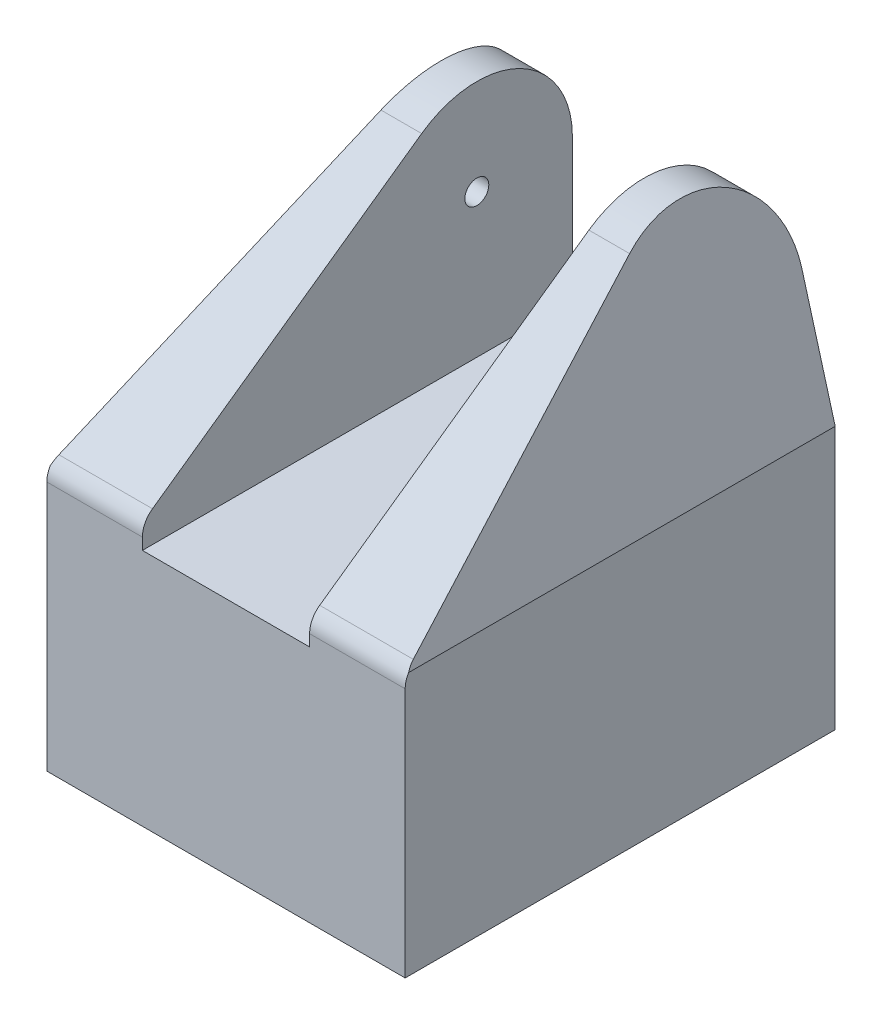
ISO-10303-21;
HEADER;
FILE_DESCRIPTION(('STEP AP214'),'2;1');
FILE_NAME('part.step','',(''),(''),'','','');
FILE_SCHEMA(('AUTOMOTIVE_DESIGN { 1 0 10303 214 1 1 1 1 }'));
ENDSEC;
DATA;
#1=APPLICATION_CONTEXT('core data for automotive mechanical design processes');
#2=APPLICATION_PROTOCOL_DEFINITION('international standard','automotive_design',2000,#1);
#3=PRODUCT_CONTEXT('',#1,'mechanical');
#4=PRODUCT('Part','Part','',(#3));
#5=PRODUCT_RELATED_PRODUCT_CATEGORY('part','',(#4));
#6=PRODUCT_DEFINITION_FORMATION('','',#4);
#7=PRODUCT_DEFINITION_CONTEXT('part definition',#1,'design');
#8=PRODUCT_DEFINITION('design','',#6,#7);
#9=PRODUCT_DEFINITION_SHAPE('','',#8);
#10=(LENGTH_UNIT() NAMED_UNIT(*) SI_UNIT(.MILLI.,.METRE.));
#11=(NAMED_UNIT(*) PLANE_ANGLE_UNIT() SI_UNIT($,.RADIAN.));
#12=(NAMED_UNIT(*) SI_UNIT($,.STERADIAN.) SOLID_ANGLE_UNIT());
#13=UNCERTAINTY_MEASURE_WITH_UNIT(LENGTH_MEASURE(1.E-05),#10,'distance_accuracy_value','');
#14=(GEOMETRIC_REPRESENTATION_CONTEXT(3) GLOBAL_UNCERTAINTY_ASSIGNED_CONTEXT((#13)) GLOBAL_UNIT_ASSIGNED_CONTEXT((#10,
#11,#12)) REPRESENTATION_CONTEXT('',''));
#15=CARTESIAN_POINT('',(0.,0.,0.));
#16=DIRECTION('',(0.,0.,1.));
#17=DIRECTION('',(1.,0.,0.));
#18=AXIS2_PLACEMENT_3D('',#15,#16,#17);
#19=CARTESIAN_POINT('',(150.,160.,40.));
#20=DIRECTION('',(-1.,0.,0.));
#21=DIRECTION('',(0.,0.,1.));
#22=AXIS2_PLACEMENT_3D('',#19,#20,#21);
#23=CYLINDRICAL_SURFACE('',#22,40.);
#24=CARTESIAN_POINT('',(136.111111111111,160.,40.));
#25=DIRECTION('',(-0.963517909629941,-0.267643863786095,0.));
#26=DIRECTION('',(-0.267643863786095,0.963517909629941,0.));
#27=AXIS2_PLACEMENT_3D('',#24,#25,#26);
#28=ELLIPSE('',#27,41.514537093932,40.);
#29=CARTESIAN_POINT('',(127.038738316447,192.660542060791,63.0930507359967));
#30=VERTEX_POINT('',#29);
#31=CARTESIAN_POINT('',(136.111111111111,160.,0.));
#32=VERTEX_POINT('',#31);
#33=EDGE_CURVE('E169',#30,#32,#28,.T.);
#34=ORIENTED_EDGE('',*,*,#33,.T.);
#35=DIRECTION('',(-1.,0.,0.));
#36=VECTOR('',#35,1.);
#37=CARTESIAN_POINT('',(150.,160.,0.));
#38=LINE('',#37,#36);
#39=CARTESIAN_POINT('',(110.,160.,0.));
#40=VERTEX_POINT('',#39);
#41=EDGE_CURVE('E150',#32,#40,#38,.T.);
#42=ORIENTED_EDGE('',*,*,#41,.T.);
#43=CARTESIAN_POINT('',(110.,160.,40.));
#44=DIRECTION('',(1.,0.,0.));
#45=DIRECTION('',(0.,0.,-1.));
#46=AXIS2_PLACEMENT_3D('',#43,#44,#45);
#47=CIRCLE('',#46,40.);
#48=CARTESIAN_POINT('',(110.,192.660542060791,63.0930507359967));
#49=VERTEX_POINT('',#48);
#50=EDGE_CURVE('E216',#40,#49,#47,.T.);
#51=ORIENTED_EDGE('',*,*,#50,.T.);
#52=DIRECTION('',(-1.,0.,0.));
#53=VECTOR('',#52,1.);
#54=CARTESIAN_POINT('',(150.,192.660542060791,63.0930507359967));
#55=LINE('',#54,#53);
#56=EDGE_CURVE('E178',#30,#49,#55,.T.);
#57=ORIENTED_EDGE('',*,*,#56,.F.);
#58=EDGE_LOOP('',(#34,#42,#51,#57));
#59=FACE_BOUND('',#58,.T.);
#60=ADVANCED_FACE('F33',(#59),#23,.T.);
#61=CARTESIAN_POINT('',(150.,192.660542060791,63.0930507359967));
#62=DIRECTION('',(0.,-0.816513551519769,-0.577326268399917));
#63=DIRECTION('',(0.,0.577326268399917,-0.816513551519769));
#64=AXIS2_PLACEMENT_3D('',#61,#62,#63);
#65=PLANE('',#64);
#66=DIRECTION('',(-1.,0.,0.));
#67=VECTOR('',#66,1.);
#68=CARTESIAN_POINT('',(150.,112.988568257822,175.773262683999));
#69=LINE('',#68,#67);
#70=CARTESIAN_POINT('',(110.,112.988568257822,175.773262683999));
#71=VERTEX_POINT('',#70);
#72=CARTESIAN_POINT('',(149.169842150605,112.988568257822,175.773262683999));
#73=VERTEX_POINT('',#72);
#74=EDGE_CURVE('E191',#71,#73,#69,.F.);
#75=ORIENTED_EDGE('',*,*,#74,.T.);
#76=DIRECTION('',(-0.158345171090726,0.570042615926613,-0.806212269082896));
#77=VECTOR('',#76,1.);
#78=CARTESIAN_POINT('',(127.614450466932,190.587978319043,66.0242812622218));
#79=LINE('',#78,#77);
#80=EDGE_CURVE('E56',#73,#30,#79,.T.);
#81=ORIENTED_EDGE('',*,*,#80,.T.);
#82=ORIENTED_EDGE('',*,*,#56,.T.);
#83=DIRECTION('',(0.,-0.577326268399917,0.816513551519769));
#84=VECTOR('',#83,1.);
#85=CARTESIAN_POINT('',(110.,192.660542060791,63.0930507359967));
#86=LINE('',#85,#84);
#87=EDGE_CURVE('E205',#49,#71,#86,.T.);
#88=ORIENTED_EDGE('',*,*,#87,.T.);
#89=EDGE_LOOP('',(#75,#81,#82,#88));
#90=FACE_BOUND('',#89,.T.);
#91=ADVANCED_FACE('F214',(#90),#65,.F.);
#92=CARTESIAN_POINT('',(150.,104.823432742624,170.));
#93=DIRECTION('',(-1.,0.,0.));
#94=DIRECTION('',(0.,0.,1.));
#95=AXIS2_PLACEMENT_3D('',#92,#93,#94);
#96=CYLINDRICAL_SURFACE('',#95,10.);
#97=CARTESIAN_POINT('',(151.437935349271,104.823432742624,170.));
#98=DIRECTION('',(-0.963517909629941,-0.267643863786095,0.));
#99=DIRECTION('',(-0.267643863786095,0.963517909629941,0.));
#100=AXIS2_PLACEMENT_3D('',#97,#98,#99);
#101=ELLIPSE('',#100,10.378634273483,10.);
#102=CARTESIAN_POINT('',(150.,110.,178.555884023867));
#103=VERTEX_POINT('',#102);
#104=EDGE_CURVE('E11',#73,#103,#101,.F.);
#105=ORIENTED_EDGE('',*,*,#104,.F.);
#106=ORIENTED_EDGE('',*,*,#74,.F.);
#107=CARTESIAN_POINT('',(110.,104.823432742624,170.));
#108=DIRECTION('',(1.,0.,0.));
#109=DIRECTION('',(0.,0.,-1.));
#110=AXIS2_PLACEMENT_3D('',#107,#108,#109);
#111=CIRCLE('',#110,10.);
#112=CARTESIAN_POINT('',(110.,104.823432742624,180.));
#113=VERTEX_POINT('',#112);
#114=EDGE_CURVE('E42',#113,#71,#111,.F.);
#115=ORIENTED_EDGE('',*,*,#114,.F.);
#116=DIRECTION('',(-1.,0.,0.));
#117=VECTOR('',#116,1.);
#118=CARTESIAN_POINT('',(150.,104.823432742624,180.));
#119=LINE('',#118,#117);
#120=CARTESIAN_POINT('',(150.,104.823432742624,180.));
#121=VERTEX_POINT('',#120);
#122=EDGE_CURVE('E185',#121,#113,#119,.T.);
#123=ORIENTED_EDGE('',*,*,#122,.F.);
#124=CARTESIAN_POINT('',(150.,104.823432742624,170.));
#125=DIRECTION('',(-1.,0.,0.));
#126=DIRECTION('',(0.,0.,1.));
#127=AXIS2_PLACEMENT_3D('',#124,#125,#126);
#128=CIRCLE('',#127,10.);
#129=EDGE_CURVE('E195',#103,#121,#128,.F.);
#130=ORIENTED_EDGE('',*,*,#129,.F.);
#131=EDGE_LOOP('',(#105,#106,#115,#123,#130));
#132=FACE_BOUND('',#131,.T.);
#133=ADVANCED_FACE('F219',(#132),#96,.T.);
#134=CARTESIAN_POINT('',(150.,0.,180.));
#135=DIRECTION('',(0.,1.,0.));
#136=DIRECTION('',(0.,0.,1.));
#137=AXIS2_PLACEMENT_3D('',#134,#135,#136);
#138=PLANE('',#137);
#139=CARTESIAN_POINT('',(75.,0.,40.));
#140=DIRECTION('',(0.,-1.,0.));
#141=DIRECTION('',(0.,0.,-1.));
#142=AXIS2_PLACEMENT_3D('',#139,#140,#141);
#143=CIRCLE('',#142,12.5);
#144=CARTESIAN_POINT('',(75.,0.,27.5));
#145=VERTEX_POINT('',#144);
#146=EDGE_CURVE('E274',#145,#145,#143,.T.);
#147=ORIENTED_EDGE('',*,*,#146,.F.);
#148=EDGE_LOOP('',(#147));
#149=FACE_BOUND('',#148,.T.);
#150=DIRECTION('',(0.,0.,-1.));
#151=VECTOR('',#150,1.);
#152=CARTESIAN_POINT('',(0.,0.,180.));
#153=LINE('',#152,#151);
#154=CARTESIAN_POINT('',(0.,0.,180.));
#155=VERTEX_POINT('',#154);
#156=CARTESIAN_POINT('',(0.,0.,0.));
#157=VERTEX_POINT('',#156);
#158=EDGE_CURVE('E165',#155,#157,#153,.T.);
#159=ORIENTED_EDGE('',*,*,#158,.T.);
#160=DIRECTION('',(-1.,0.,0.));
#161=VECTOR('',#160,1.);
#162=CARTESIAN_POINT('',(150.,0.,0.));
#163=LINE('',#162,#161);
#164=CARTESIAN_POINT('',(150.,0.,0.));
#165=VERTEX_POINT('',#164);
#166=EDGE_CURVE('E182',#165,#157,#163,.T.);
#167=ORIENTED_EDGE('',*,*,#166,.F.);
#168=DIRECTION('',(0.,0.,-1.));
#169=VECTOR('',#168,1.);
#170=CARTESIAN_POINT('',(150.,0.,180.));
#171=LINE('',#170,#169);
#172=CARTESIAN_POINT('',(150.,0.,180.));
#173=VERTEX_POINT('',#172);
#174=EDGE_CURVE('E155',#173,#165,#171,.T.);
#175=ORIENTED_EDGE('',*,*,#174,.F.);
#176=DIRECTION('',(-1.,0.,0.));
#177=VECTOR('',#176,1.);
#178=CARTESIAN_POINT('',(150.,0.,180.));
#179=LINE('',#178,#177);
#180=EDGE_CURVE('E159',#173,#155,#179,.T.);
#181=ORIENTED_EDGE('',*,*,#180,.T.);
#182=EDGE_LOOP('',(#159,#167,#175,#181));
#183=FACE_BOUND('',#182,.T.);
#184=ADVANCED_FACE('F227',(#149,#183),#138,.F.);
#185=CARTESIAN_POINT('',(150.,0.,0.));
#186=DIRECTION('',(0.,0.,1.));
#187=DIRECTION('',(1.,0.,0.));
#188=AXIS2_PLACEMENT_3D('',#185,#186,#187);
#189=PLANE('',#188);
#190=ORIENTED_EDGE('',*,*,#41,.F.);
#191=DIRECTION('',(-0.267643863786095,0.963517909629941,0.));
#192=VECTOR('',#191,1.);
#193=CARTESIAN_POINT('',(150.,110.,0.));
#194=LINE('',#193,#192);
#195=CARTESIAN_POINT('',(150.,110.,0.));
#196=VERTEX_POINT('',#195);
#197=EDGE_CURVE('E136',#196,#32,#194,.T.);
#198=ORIENTED_EDGE('',*,*,#197,.F.);
#199=DIRECTION('',(0.,1.,0.));
#200=VECTOR('',#199,1.);
#201=CARTESIAN_POINT('',(150.,0.,0.));
#202=LINE('',#201,#200);
#203=EDGE_CURVE('E146',#165,#196,#202,.T.);
#204=ORIENTED_EDGE('',*,*,#203,.F.);
#205=ORIENTED_EDGE('',*,*,#166,.T.);
#206=DIRECTION('',(0.,1.,0.));
#207=VECTOR('',#206,1.);
#208=CARTESIAN_POINT('',(0.,0.,0.));
#209=LINE('',#208,#207);
#210=CARTESIAN_POINT('',(0.,110.,0.));
#211=VERTEX_POINT('',#210);
#212=EDGE_CURVE('E168',#157,#211,#209,.T.);
#213=ORIENTED_EDGE('',*,*,#212,.T.);
#214=DIRECTION('',(-0.267643863786086,-0.963517909629943,0.));
#215=VECTOR('',#214,1.);
#216=CARTESIAN_POINT('',(0.,110.,0.));
#217=LINE('',#216,#215);
#218=CARTESIAN_POINT('',(13.8888888888884,160.,0.));
#219=VERTEX_POINT('',#218);
#220=EDGE_CURVE('E230',#219,#211,#217,.T.);
#221=ORIENTED_EDGE('',*,*,#220,.F.);
#222=CARTESIAN_POINT('',(40.,160.,0.));
#223=VERTEX_POINT('',#222);
#224=EDGE_CURVE('E179',#223,#219,#38,.T.);
#225=ORIENTED_EDGE('',*,*,#224,.F.);
#226=DIRECTION('',(0.,1.,0.));
#227=VECTOR('',#226,1.);
#228=CARTESIAN_POINT('',(40.,202.91684934404,0.));
#229=LINE('',#228,#227);
#230=CARTESIAN_POINT('',(40.,100.,0.));
#231=VERTEX_POINT('',#230);
#232=EDGE_CURVE('E237',#231,#223,#229,.T.);
#233=ORIENTED_EDGE('',*,*,#232,.F.);
#234=DIRECTION('',(-1.,0.,0.));
#235=VECTOR('',#234,1.);
#236=CARTESIAN_POINT('',(110.,100.,0.));
#237=LINE('',#236,#235);
#238=CARTESIAN_POINT('',(110.,100.,0.));
#239=VERTEX_POINT('',#238);
#240=EDGE_CURVE('E234',#239,#231,#237,.T.);
#241=ORIENTED_EDGE('',*,*,#240,.F.);
#242=DIRECTION('',(0.,-1.,0.));
#243=VECTOR('',#242,1.);
#244=CARTESIAN_POINT('',(110.,110.,0.));
#245=LINE('',#244,#243);
#246=EDGE_CURVE('E254',#40,#239,#245,.T.);
#247=ORIENTED_EDGE('',*,*,#246,.F.);
#248=EDGE_LOOP('',(#190,#198,#204,#205,#213,#221,#225,#233,#241,#247));
#249=FACE_BOUND('',#248,.T.);
#250=ADVANCED_FACE('F144',(#249),#189,.F.);
#251=CARTESIAN_POINT('',(40.,192.660542060791,63.0930507359967));
#252=VERTEX_POINT('',#251);
#253=CARTESIAN_POINT('',(22.9612616835522,192.660542060791,63.0930507359967));
#254=VERTEX_POINT('',#253);
#255=EDGE_CURVE('E175',#252,#254,#55,.T.);
#256=ORIENTED_EDGE('',*,*,#255,.F.);
#257=CARTESIAN_POINT('',(40.,160.,40.));
#258=DIRECTION('',(-1.,0.,0.));
#259=DIRECTION('',(0.,-1.,0.));
#260=AXIS2_PLACEMENT_3D('',#257,#258,#259);
#261=CIRCLE('',#260,40.);
#262=EDGE_CURVE('E217',#252,#223,#261,.T.);
#263=ORIENTED_EDGE('',*,*,#262,.T.);
#264=ORIENTED_EDGE('',*,*,#224,.T.);
#265=CARTESIAN_POINT('',(13.8888888888884,160.,40.));
#266=DIRECTION('',(0.963517909629943,-0.267643863786086,0.));
#267=DIRECTION('',(-0.267643863786086,-0.963517909629943,0.));
#268=AXIS2_PLACEMENT_3D('',#265,#266,#267);
#269=ELLIPSE('',#268,41.5145370939319,40.);
#270=EDGE_CURVE('E245',#219,#254,#269,.T.);
#271=ORIENTED_EDGE('',*,*,#270,.T.);
#272=EDGE_LOOP('',(#256,#263,#264,#271));
#273=FACE_BOUND('',#272,.T.);
#274=ADVANCED_FACE('F314',(#273),#23,.T.);
#275=CARTESIAN_POINT('',(0.830157849394941,112.988568257822,175.773262683999));
#276=VERTEX_POINT('',#275);
#277=CARTESIAN_POINT('',(40.,112.988568257822,175.773262683999));
#278=VERTEX_POINT('',#277);
#279=EDGE_CURVE('E194',#276,#278,#69,.F.);
#280=ORIENTED_EDGE('',*,*,#279,.T.);
#281=DIRECTION('',(0.,0.577326268399917,-0.816513551519769));
#282=VECTOR('',#281,1.);
#283=CARTESIAN_POINT('',(40.,192.660542060791,63.0930507359967));
#284=LINE('',#283,#282);
#285=EDGE_CURVE('E247',#278,#252,#284,.T.);
#286=ORIENTED_EDGE('',*,*,#285,.T.);
#287=ORIENTED_EDGE('',*,*,#255,.T.);
#288=DIRECTION('',(-0.15834517109072,-0.570042615926614,0.806212269082897));
#289=VECTOR('',#288,1.);
#290=CARTESIAN_POINT('',(26.1465285142292,204.127502651228,46.8753083097162));
#291=LINE('',#290,#289);
#292=EDGE_CURVE('E141',#254,#276,#291,.T.);
#293=ORIENTED_EDGE('',*,*,#292,.T.);
#294=EDGE_LOOP('',(#280,#286,#287,#293));
#295=FACE_BOUND('',#294,.T.);
#296=ADVANCED_FACE('F310',(#295),#65,.F.);
#297=CARTESIAN_POINT('',(150.,110.,180.));
#298=DIRECTION('',(0.,0.,-1.));
#299=DIRECTION('',(-1.,0.,0.));
#300=AXIS2_PLACEMENT_3D('',#297,#298,#299);
#301=PLANE('',#300);
#302=ORIENTED_EDGE('',*,*,#122,.T.);
#303=DIRECTION('',(0.,-1.,0.));
#304=VECTOR('',#303,1.);
#305=CARTESIAN_POINT('',(110.,110.,180.));
#306=LINE('',#305,#304);
#307=CARTESIAN_POINT('',(110.,100.,180.));
#308=VERTEX_POINT('',#307);
#309=EDGE_CURVE('E208',#113,#308,#306,.T.);
#310=ORIENTED_EDGE('',*,*,#309,.T.);
#311=DIRECTION('',(-1.,0.,0.));
#312=VECTOR('',#311,1.);
#313=CARTESIAN_POINT('',(110.,100.,180.));
#314=LINE('',#313,#312);
#315=CARTESIAN_POINT('',(40.,100.,180.));
#316=VERTEX_POINT('',#315);
#317=EDGE_CURVE('E259',#308,#316,#314,.T.);
#318=ORIENTED_EDGE('',*,*,#317,.T.);
#319=DIRECTION('',(0.,1.,0.));
#320=VECTOR('',#319,1.);
#321=CARTESIAN_POINT('',(40.,100.,180.));
#322=LINE('',#321,#320);
#323=CARTESIAN_POINT('',(40.,104.823432742624,180.));
#324=VERTEX_POINT('',#323);
#325=EDGE_CURVE('E264',#316,#324,#322,.T.);
#326=ORIENTED_EDGE('',*,*,#325,.T.);
#327=CARTESIAN_POINT('',(0.,104.823432742624,180.));
#328=VERTEX_POINT('',#327);
#329=EDGE_CURVE('E184',#324,#328,#119,.T.);
#330=ORIENTED_EDGE('',*,*,#329,.T.);
#331=DIRECTION('',(0.,-1.,0.));
#332=VECTOR('',#331,1.);
#333=CARTESIAN_POINT('',(0.,110.,180.));
#334=LINE('',#333,#332);
#335=EDGE_CURVE('E161',#328,#155,#334,.T.);
#336=ORIENTED_EDGE('',*,*,#335,.T.);
#337=ORIENTED_EDGE('',*,*,#180,.F.);
#338=DIRECTION('',(0.,-1.,0.));
#339=VECTOR('',#338,1.);
#340=CARTESIAN_POINT('',(150.,110.,180.));
#341=LINE('',#340,#339);
#342=EDGE_CURVE('E157',#121,#173,#341,.T.);
#343=ORIENTED_EDGE('',*,*,#342,.F.);
#344=EDGE_LOOP('',(#302,#310,#318,#326,#330,#336,#337,#343));
#345=FACE_BOUND('',#344,.T.);
#346=ADVANCED_FACE('F223',(#345),#301,.F.);
#347=CARTESIAN_POINT('',(150.,160.,40.));
#348=DIRECTION('',(-1.,0.,0.));
#349=DIRECTION('',(0.,0.,1.));
#350=AXIS2_PLACEMENT_3D('',#347,#348,#349);
#351=PLANE('',#350);
#352=ORIENTED_EDGE('',*,*,#203,.T.);
#353=DIRECTION('',(0.,0.,-1.));
#354=VECTOR('',#353,1.);
#355=CARTESIAN_POINT('',(150.,110.,180.));
#356=LINE('',#355,#354);
#357=EDGE_CURVE('E133',#103,#196,#356,.T.);
#358=ORIENTED_EDGE('',*,*,#357,.F.);
#359=ORIENTED_EDGE('',*,*,#129,.T.);
#360=ORIENTED_EDGE('',*,*,#342,.T.);
#361=ORIENTED_EDGE('',*,*,#174,.T.);
#362=EDGE_LOOP('',(#352,#358,#359,#360,#361));
#363=FACE_BOUND('',#362,.T.);
#364=ADVANCED_FACE('F153',(#363),#351,.F.);
#365=CARTESIAN_POINT('',(0.,160.,40.));
#366=DIRECTION('',(-1.,0.,0.));
#367=DIRECTION('',(0.,0.,1.));
#368=AXIS2_PLACEMENT_3D('',#365,#366,#367);
#369=PLANE('',#368);
#370=DIRECTION('',(0.,0.,-1.));
#371=VECTOR('',#370,1.);
#372=CARTESIAN_POINT('',(0.,110.,180.));
#373=LINE('',#372,#371);
#374=CARTESIAN_POINT('',(0.,110.,178.555884023867));
#375=VERTEX_POINT('',#374);
#376=EDGE_CURVE('E49',#375,#211,#373,.T.);
#377=ORIENTED_EDGE('',*,*,#376,.T.);
#378=ORIENTED_EDGE('',*,*,#212,.F.);
#379=ORIENTED_EDGE('',*,*,#158,.F.);
#380=ORIENTED_EDGE('',*,*,#335,.F.);
#381=CARTESIAN_POINT('',(0.,104.823432742624,170.));
#382=DIRECTION('',(-1.,0.,0.));
#383=DIRECTION('',(0.,0.,1.));
#384=AXIS2_PLACEMENT_3D('',#381,#382,#383);
#385=CIRCLE('',#384,10.);
#386=EDGE_CURVE('E188',#328,#375,#385,.T.);
#387=ORIENTED_EDGE('',*,*,#386,.T.);
#388=EDGE_LOOP('',(#377,#378,#379,#380,#387));
#389=FACE_BOUND('',#388,.T.);
#390=ADVANCED_FACE('F232',(#389),#369,.T.);
#391=CARTESIAN_POINT('',(40.,104.823432742624,170.));
#392=DIRECTION('',(-1.,0.,0.));
#393=DIRECTION('',(0.,-1.,0.));
#394=AXIS2_PLACEMENT_3D('',#391,#392,#393);
#395=CIRCLE('',#394,10.);
#396=EDGE_CURVE('E199',#278,#324,#395,.F.);
#397=ORIENTED_EDGE('',*,*,#396,.F.);
#398=ORIENTED_EDGE('',*,*,#279,.F.);
#399=CARTESIAN_POINT('',(-1.437935349271,104.823432742624,170.));
#400=DIRECTION('',(0.963517909629943,-0.267643863786086,0.));
#401=DIRECTION('',(-0.267643863786086,-0.963517909629943,0.));
#402=AXIS2_PLACEMENT_3D('',#399,#400,#401);
#403=ELLIPSE('',#402,10.378634273483,10.);
#404=EDGE_CURVE('E197',#375,#276,#403,.F.);
#405=ORIENTED_EDGE('',*,*,#404,.F.);
#406=ORIENTED_EDGE('',*,*,#386,.F.);
#407=ORIENTED_EDGE('',*,*,#329,.F.);
#408=EDGE_LOOP('',(#397,#398,#405,#406,#407));
#409=FACE_BOUND('',#408,.T.);
#410=ADVANCED_FACE('F35',(#409),#96,.T.);
#411=CARTESIAN_POINT('',(0.,110.,180.));
#412=DIRECTION('',(0.963517909629943,-0.267643863786086,0.));
#413=DIRECTION('',(0.267643863786086,0.963517909629943,0.));
#414=AXIS2_PLACEMENT_3D('',#411,#412,#413);
#415=PLANE('',#414);
#416=ORIENTED_EDGE('',*,*,#220,.T.);
#417=ORIENTED_EDGE('',*,*,#376,.F.);
#418=ORIENTED_EDGE('',*,*,#404,.T.);
#419=ORIENTED_EDGE('',*,*,#292,.F.);
#420=ORIENTED_EDGE('',*,*,#270,.F.);
#421=EDGE_LOOP('',(#416,#417,#418,#419,#420));
#422=FACE_BOUND('',#421,.T.);
#423=ADVANCED_FACE('F312',(#422),#415,.F.);
#424=CARTESIAN_POINT('',(110.,110.,180.));
#425=DIRECTION('',(1.,0.,0.));
#426=DIRECTION('',(0.,0.,-1.));
#427=AXIS2_PLACEMENT_3D('',#424,#425,#426);
#428=PLANE('',#427);
#429=CARTESIAN_POINT('',(110.,160.,40.));
#430=DIRECTION('',(1.,0.,0.));
#431=DIRECTION('',(0.,0.,-1.));
#432=AXIS2_PLACEMENT_3D('',#429,#430,#431);
#433=CIRCLE('',#432,5.);
#434=CARTESIAN_POINT('',(110.,160.,35.));
#435=VERTEX_POINT('',#434);
#436=EDGE_CURVE('E277',#435,#435,#433,.F.);
#437=ORIENTED_EDGE('',*,*,#436,.F.);
#438=EDGE_LOOP('',(#437));
#439=FACE_BOUND('',#438,.T.);
#440=ORIENTED_EDGE('',*,*,#246,.T.);
#441=DIRECTION('',(0.,0.,-1.));
#442=VECTOR('',#441,1.);
#443=CARTESIAN_POINT('',(110.,100.,180.));
#444=LINE('',#443,#442);
#445=EDGE_CURVE('E263',#308,#239,#444,.T.);
#446=ORIENTED_EDGE('',*,*,#445,.F.);
#447=ORIENTED_EDGE('',*,*,#309,.F.);
#448=ORIENTED_EDGE('',*,*,#114,.T.);
#449=ORIENTED_EDGE('',*,*,#87,.F.);
#450=ORIENTED_EDGE('',*,*,#50,.F.);
#451=EDGE_LOOP('',(#440,#446,#447,#448,#449,#450));
#452=FACE_BOUND('',#451,.T.);
#453=ADVANCED_FACE('F204',(#439,#452),#428,.F.);
#454=CARTESIAN_POINT('',(40.,202.91684934404,180.));
#455=DIRECTION('',(-1.,0.,0.));
#456=DIRECTION('',(0.,-1.,0.));
#457=AXIS2_PLACEMENT_3D('',#454,#455,#456);
#458=PLANE('',#457);
#459=CARTESIAN_POINT('',(40.,160.,40.));
#460=DIRECTION('',(-1.,0.,0.));
#461=DIRECTION('',(0.,-1.,0.));
#462=AXIS2_PLACEMENT_3D('',#459,#460,#461);
#463=CIRCLE('',#462,5.);
#464=CARTESIAN_POINT('',(40.,155.,40.));
#465=VERTEX_POINT('',#464);
#466=EDGE_CURVE('E37',#465,#465,#463,.F.);
#467=ORIENTED_EDGE('',*,*,#466,.F.);
#468=EDGE_LOOP('',(#467));
#469=FACE_BOUND('',#468,.T.);
#470=ORIENTED_EDGE('',*,*,#285,.F.);
#471=ORIENTED_EDGE('',*,*,#396,.T.);
#472=ORIENTED_EDGE('',*,*,#325,.F.);
#473=DIRECTION('',(0.,0.,-1.));
#474=VECTOR('',#473,1.);
#475=CARTESIAN_POINT('',(40.,100.,180.));
#476=LINE('',#475,#474);
#477=EDGE_CURVE('E151',#316,#231,#476,.T.);
#478=ORIENTED_EDGE('',*,*,#477,.T.);
#479=ORIENTED_EDGE('',*,*,#232,.T.);
#480=ORIENTED_EDGE('',*,*,#262,.F.);
#481=EDGE_LOOP('',(#470,#471,#472,#478,#479,#480));
#482=FACE_BOUND('',#481,.T.);
#483=ADVANCED_FACE('F299',(#469,#482),#458,.F.);
#484=CARTESIAN_POINT('',(110.,100.,180.));
#485=DIRECTION('',(0.,-1.,0.));
#486=DIRECTION('',(0.,0.,-1.));
#487=AXIS2_PLACEMENT_3D('',#484,#485,#486);
#488=PLANE('',#487);
#489=ORIENTED_EDGE('',*,*,#240,.T.);
#490=ORIENTED_EDGE('',*,*,#477,.F.);
#491=ORIENTED_EDGE('',*,*,#317,.F.);
#492=ORIENTED_EDGE('',*,*,#445,.T.);
#493=EDGE_LOOP('',(#489,#490,#491,#492));
#494=FACE_BOUND('',#493,.T.);
#495=ADVANCED_FACE('F302',(#494),#488,.F.);
#496=CARTESIAN_POINT('',(150.,110.,180.));
#497=DIRECTION('',(-0.963517909629941,-0.267643863786095,0.));
#498=DIRECTION('',(0.267643863786095,-0.963517909629941,0.));
#499=AXIS2_PLACEMENT_3D('',#496,#497,#498);
#500=PLANE('',#499);
#501=ORIENTED_EDGE('',*,*,#33,.F.);
#502=ORIENTED_EDGE('',*,*,#80,.F.);
#503=ORIENTED_EDGE('',*,*,#104,.T.);
#504=ORIENTED_EDGE('',*,*,#357,.T.);
#505=ORIENTED_EDGE('',*,*,#197,.T.);
#506=EDGE_LOOP('',(#501,#502,#503,#504,#505));
#507=FACE_BOUND('',#506,.T.);
#508=ADVANCED_FACE('F135',(#507),#500,.F.);
#509=CARTESIAN_POINT('',(75.,10.,40.));
#510=DIRECTION('',(0.,-1.,0.));
#511=DIRECTION('',(0.,0.,-1.));
#512=AXIS2_PLACEMENT_3D('',#509,#510,#511);
#513=CYLINDRICAL_SURFACE('',#512,12.5);
#514=CARTESIAN_POINT('',(75.,10.,40.));
#515=DIRECTION('',(0.,-1.,0.));
#516=DIRECTION('',(0.,0.,-1.));
#517=AXIS2_PLACEMENT_3D('',#514,#515,#516);
#518=CIRCLE('',#517,12.5);
#519=CARTESIAN_POINT('',(75.,10.,27.5));
#520=VERTEX_POINT('',#519);
#521=EDGE_CURVE('E239',#520,#520,#518,.T.);
#522=ORIENTED_EDGE('',*,*,#521,.F.);
#523=EDGE_LOOP('',(#522));
#524=FACE_BOUND('',#523,.T.);
#525=ORIENTED_EDGE('',*,*,#146,.T.);
#526=EDGE_LOOP('',(#525));
#527=FACE_BOUND('',#526,.T.);
#528=ADVANCED_FACE('F320',(#524,#527),#513,.F.);
#529=CARTESIAN_POINT('',(75.,10.,40.));
#530=DIRECTION('',(0.,-1.,0.));
#531=DIRECTION('',(0.,0.,-1.));
#532=AXIS2_PLACEMENT_3D('',#529,#530,#531);
#533=PLANE('',#532);
#534=ORIENTED_EDGE('',*,*,#521,.T.);
#535=EDGE_LOOP('',(#534));
#536=FACE_BOUND('',#535,.T.);
#537=ADVANCED_FACE('F345',(#536),#533,.T.);
#538=CARTESIAN_POINT('',(30.,160.,40.));
#539=DIRECTION('',(1.,0.,0.));
#540=DIRECTION('',(0.,1.,0.));
#541=AXIS2_PLACEMENT_3D('',#538,#539,#540);
#542=PLANE('',#541);
#543=CARTESIAN_POINT('',(30.,160.,40.));
#544=DIRECTION('',(1.,0.,0.));
#545=DIRECTION('',(0.,1.,0.));
#546=AXIS2_PLACEMENT_3D('',#543,#544,#545);
#547=CIRCLE('',#546,5.);
#548=CARTESIAN_POINT('',(30.,165.,40.));
#549=VERTEX_POINT('',#548);
#550=EDGE_CURVE('E285',#549,#549,#547,.T.);
#551=ORIENTED_EDGE('',*,*,#550,.T.);
#552=EDGE_LOOP('',(#551));
#553=FACE_BOUND('',#552,.T.);
#554=ADVANCED_FACE('F289',(#553),#542,.T.);
#555=CARTESIAN_POINT('',(120.,160.,40.));
#556=DIRECTION('',(-1.,0.,0.));
#557=DIRECTION('',(0.,-1.,0.));
#558=AXIS2_PLACEMENT_3D('',#555,#556,#557);
#559=CYLINDRICAL_SURFACE('',#558,5.);
#560=ORIENTED_EDGE('',*,*,#550,.F.);
#561=EDGE_LOOP('',(#560));
#562=FACE_BOUND('',#561,.T.);
#563=ORIENTED_EDGE('',*,*,#466,.T.);
#564=EDGE_LOOP('',(#563));
#565=FACE_BOUND('',#564,.T.);
#566=ADVANCED_FACE('F291',(#562,#565),#559,.F.);
#567=CARTESIAN_POINT('',(120.,160.,40.));
#568=DIRECTION('',(1.,0.,0.));
#569=DIRECTION('',(0.,1.,0.));
#570=AXIS2_PLACEMENT_3D('',#567,#568,#569);
#571=CIRCLE('',#570,5.);
#572=CARTESIAN_POINT('',(120.,165.,40.));
#573=VERTEX_POINT('',#572);
#574=EDGE_CURVE('E282',#573,#573,#571,.T.);
#575=ORIENTED_EDGE('',*,*,#574,.T.);
#576=EDGE_LOOP('',(#575));
#577=FACE_BOUND('',#576,.T.);
#578=ORIENTED_EDGE('',*,*,#436,.T.);
#579=EDGE_LOOP('',(#578));
#580=FACE_BOUND('',#579,.T.);
#581=ADVANCED_FACE('F294',(#577,#580),#559,.F.);
#582=CARTESIAN_POINT('',(120.,160.,40.));
#583=DIRECTION('',(1.,0.,0.));
#584=DIRECTION('',(0.,1.,0.));
#585=AXIS2_PLACEMENT_3D('',#582,#583,#584);
#586=PLANE('',#585);
#587=ORIENTED_EDGE('',*,*,#574,.F.);
#588=EDGE_LOOP('',(#587));
#589=FACE_BOUND('',#588,.T.);
#590=ADVANCED_FACE('F363',(#589),#586,.F.);
#591=CLOSED_SHELL('',(#60,#91,#133,#184,#250,#274,#296,#346,#364,#390,#410,#423,#453,#483,#495,
#508,#528,#537,#554,#566,#581,#590));
#592=MANIFOLD_SOLID_BREP('B2',#591);
#593=ADVANCED_BREP_SHAPE_REPRESENTATION('',(#18,#592),#14);
#594=SHAPE_DEFINITION_REPRESENTATION(#9,#593);
ENDSEC;
END-ISO-10303-21;
